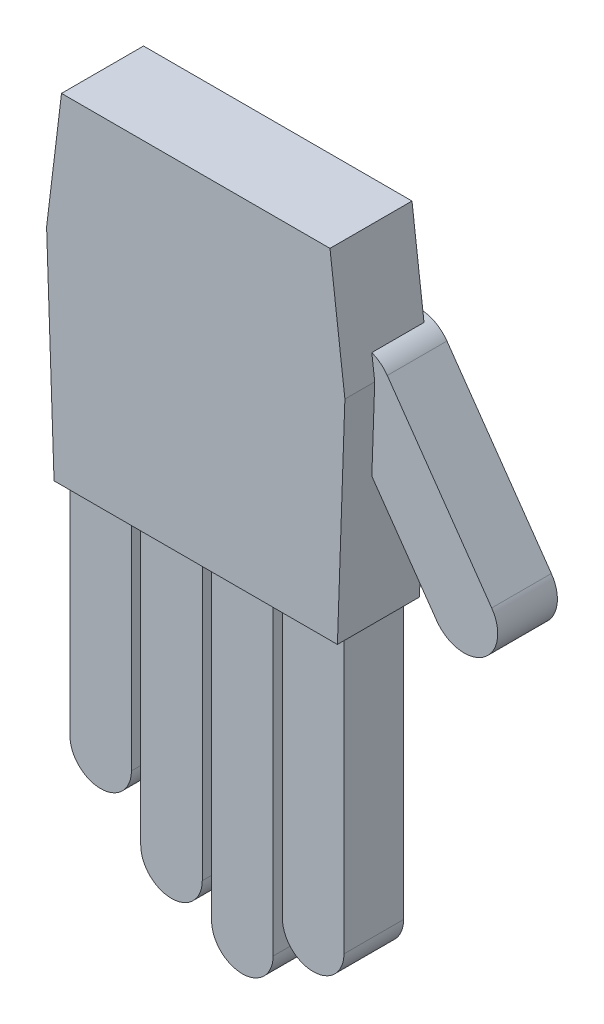
ISO-10303-21;
HEADER;
FILE_DESCRIPTION(('STEP AP214'),'2;1');
FILE_NAME('part.step','',(''),(''),'','','');
FILE_SCHEMA(('AUTOMOTIVE_DESIGN { 1 0 10303 214 1 1 1 1 }'));
ENDSEC;
DATA;
#1=APPLICATION_CONTEXT('core data for automotive mechanical design processes');
#2=APPLICATION_PROTOCOL_DEFINITION('international standard','automotive_design',2000,#1);
#3=PRODUCT_CONTEXT('',#1,'mechanical');
#4=PRODUCT('Part','Part','',(#3));
#5=PRODUCT_RELATED_PRODUCT_CATEGORY('part','',(#4));
#6=PRODUCT_DEFINITION_FORMATION('','',#4);
#7=PRODUCT_DEFINITION_CONTEXT('part definition',#1,'design');
#8=PRODUCT_DEFINITION('design','',#6,#7);
#9=PRODUCT_DEFINITION_SHAPE('','',#8);
#10=(LENGTH_UNIT() NAMED_UNIT(*) SI_UNIT(.MILLI.,.METRE.));
#11=(NAMED_UNIT(*) PLANE_ANGLE_UNIT() SI_UNIT($,.RADIAN.));
#12=(NAMED_UNIT(*) SI_UNIT($,.STERADIAN.) SOLID_ANGLE_UNIT());
#13=UNCERTAINTY_MEASURE_WITH_UNIT(LENGTH_MEASURE(1.E-05),#10,'distance_accuracy_value','');
#14=(GEOMETRIC_REPRESENTATION_CONTEXT(3) GLOBAL_UNCERTAINTY_ASSIGNED_CONTEXT((#13)) GLOBAL_UNIT_ASSIGNED_CONTEXT((#10,
#11,#12)) REPRESENTATION_CONTEXT('',''));
#15=CARTESIAN_POINT('',(0.,0.,0.));
#16=DIRECTION('',(0.,0.,1.));
#17=DIRECTION('',(1.,0.,0.));
#18=AXIS2_PLACEMENT_3D('',#15,#16,#17);
#19=CARTESIAN_POINT('',(40.,-60.,11.));
#20=DIRECTION('',(-0.999405999353588,0.0344622758397789,0.));
#21=DIRECTION('',(-0.0344622758397789,-0.999405999353588,0.));
#22=AXIS2_PLACEMENT_3D('',#19,#20,#21);
#23=PLANE('',#22);
#24=DIRECTION('',(0.,0.,-1.));
#25=VECTOR('',#24,1.);
#26=CARTESIAN_POINT('',(39.2307089176451,-82.3094413882934,11.));
#27=LINE('',#26,#25);
#28=CARTESIAN_POINT('',(39.2307089176451,-82.3094413882934,3.));
#29=VERTEX_POINT('',#28);
#30=CARTESIAN_POINT('',(39.2307089176451,-82.3094413882934,-11.));
#31=VERTEX_POINT('',#30);
#32=EDGE_CURVE('E48',#29,#31,#27,.T.);
#33=ORIENTED_EDGE('',*,*,#32,.F.);
#34=DIRECTION('',(0.0344622758397789,0.999405999353588,0.));
#35=VECTOR('',#34,1.);
#36=CARTESIAN_POINT('',(40.,-60.,3.));
#37=LINE('',#36,#35);
#38=CARTESIAN_POINT('',(40.,-60.,3.));
#39=VERTEX_POINT('',#38);
#40=EDGE_CURVE('E224',#29,#39,#37,.T.);
#41=ORIENTED_EDGE('',*,*,#40,.T.);
#42=DIRECTION('',(0.,0.,-1.));
#43=VECTOR('',#42,1.);
#44=CARTESIAN_POINT('',(40.,-60.,11.));
#45=LINE('',#44,#43);
#46=CARTESIAN_POINT('',(40.,-60.,11.));
#47=VERTEX_POINT('',#46);
#48=EDGE_CURVE('E375',#47,#39,#45,.T.);
#49=ORIENTED_EDGE('',*,*,#48,.F.);
#50=DIRECTION('',(0.0344622758397789,0.999405999353588,0.));
#51=VECTOR('',#50,1.);
#52=CARTESIAN_POINT('',(40.,-60.,11.));
#53=LINE('',#52,#51);
#54=CARTESIAN_POINT('',(38.,-118.,11.));
#55=VERTEX_POINT('',#54);
#56=EDGE_CURVE('E351',#55,#47,#53,.T.);
#57=ORIENTED_EDGE('',*,*,#56,.F.);
#58=DIRECTION('',(0.,0.,-1.));
#59=VECTOR('',#58,1.);
#60=CARTESIAN_POINT('',(38.,-118.,11.));
#61=LINE('',#60,#59);
#62=CARTESIAN_POINT('',(38.,-118.,-11.));
#63=VERTEX_POINT('',#62);
#64=EDGE_CURVE('E378',#55,#63,#61,.T.);
#65=ORIENTED_EDGE('',*,*,#64,.T.);
#66=DIRECTION('',(0.0344622758397789,0.999405999353588,0.));
#67=VECTOR('',#66,1.);
#68=CARTESIAN_POINT('',(40.,-60.,-11.));
#69=LINE('',#68,#67);
#70=EDGE_CURVE('E364',#63,#31,#69,.T.);
#71=ORIENTED_EDGE('',*,*,#70,.T.);
#72=EDGE_LOOP('',(#33,#41,#49,#57,#65,#71));
#73=FACE_BOUND('',#72,.T.);
#74=ADVANCED_FACE('F33',(#73),#23,.F.);
#75=CARTESIAN_POINT('',(36.,-27.,11.));
#76=DIRECTION('',(-0.992733782033708,-0.120331367519237,0.));
#77=DIRECTION('',(0.120331367519237,-0.992733782033708,0.));
#78=AXIS2_PLACEMENT_3D('',#75,#76,#77);
#79=PLANE('',#78);
#80=DIRECTION('',(0.,0.,-1.));
#81=VECTOR('',#80,1.);
#82=CARTESIAN_POINT('',(39.2239075582719,-53.5972373557432,3.));
#83=LINE('',#82,#81);
#84=CARTESIAN_POINT('',(39.2239075582719,-53.5972373557432,-11.));
#85=VERTEX_POINT('',#84);
#86=CARTESIAN_POINT('',(39.2239075582719,-53.5972373557432,3.));
#87=VERTEX_POINT('',#86);
#88=EDGE_CURVE('E259',#85,#87,#83,.F.);
#89=ORIENTED_EDGE('',*,*,#88,.F.);
#90=DIRECTION('',(-0.120331367519237,0.992733782033708,0.));
#91=VECTOR('',#90,1.);
#92=CARTESIAN_POINT('',(36.,-27.,-11.));
#93=LINE('',#92,#91);
#94=CARTESIAN_POINT('',(36.,-27.,-11.));
#95=VERTEX_POINT('',#94);
#96=EDGE_CURVE('E367',#85,#95,#93,.T.);
#97=ORIENTED_EDGE('',*,*,#96,.T.);
#98=DIRECTION('',(0.,0.,-1.));
#99=VECTOR('',#98,1.);
#100=CARTESIAN_POINT('',(36.,-27.,11.));
#101=LINE('',#100,#99);
#102=CARTESIAN_POINT('',(36.,-27.,11.));
#103=VERTEX_POINT('',#102);
#104=EDGE_CURVE('E372',#103,#95,#101,.T.);
#105=ORIENTED_EDGE('',*,*,#104,.F.);
#106=DIRECTION('',(-0.120331367519237,0.992733782033708,0.));
#107=VECTOR('',#106,1.);
#108=CARTESIAN_POINT('',(36.,-27.,11.));
#109=LINE('',#108,#107);
#110=EDGE_CURVE('E353',#47,#103,#109,.T.);
#111=ORIENTED_EDGE('',*,*,#110,.F.);
#112=ORIENTED_EDGE('',*,*,#48,.T.);
#113=DIRECTION('',(-0.120331367519237,0.992733782033708,0.));
#114=VECTOR('',#113,1.);
#115=CARTESIAN_POINT('',(36.,-27.,3.));
#116=LINE('',#115,#114);
#117=EDGE_CURVE('E11',#39,#87,#116,.T.);
#118=ORIENTED_EDGE('',*,*,#117,.T.);
#119=EDGE_LOOP('',(#89,#97,#105,#111,#112,#118));
#120=FACE_BOUND('',#119,.T.);
#121=ADVANCED_FACE('F443',(#120),#79,.F.);
#122=CARTESIAN_POINT('',(0.,0.,-11.));
#123=DIRECTION('',(0.,0.,-1.));
#124=DIRECTION('',(-1.,0.,0.));
#125=AXIS2_PLACEMENT_3D('',#122,#123,#124);
#126=PLANE('',#125);
#127=ORIENTED_EDGE('',*,*,#96,.F.);
#128=CARTESIAN_POINT('',(36.,-62.,-11.));
#129=DIRECTION('',(0.,0.,-1.));
#130=DIRECTION('',(-1.,0.,0.));
#131=AXIS2_PLACEMENT_3D('',#128,#129,#130);
#132=CIRCLE('',#131,9.);
#133=CARTESIAN_POINT('',(28.6269127153286,-67.1611610992699,-11.));
#134=VERTEX_POINT('',#133);
#135=EDGE_CURVE('E41',#85,#134,#132,.F.);
#136=ORIENTED_EDGE('',*,*,#135,.T.);
#137=DIRECTION('',(0.573462344363328,-0.81923192051904,0.));
#138=VECTOR('',#137,1.);
#139=CARTESIAN_POINT('',(-12.3395302376915,-8.63767116638405,-11.));
#140=LINE('',#139,#138);
#141=EDGE_CURVE('E429',#134,#31,#140,.T.);
#142=ORIENTED_EDGE('',*,*,#141,.T.);
#143=ORIENTED_EDGE('',*,*,#70,.F.);
#144=DIRECTION('',(1.,0.,0.));
#145=VECTOR('',#144,1.);
#146=CARTESIAN_POINT('',(38.,-118.,-11.));
#147=LINE('',#146,#145);
#148=CARTESIAN_POINT('',(-38.,-118.,-11.));
#149=VERTEX_POINT('',#148);
#150=EDGE_CURVE('E362',#149,#63,#147,.T.);
#151=ORIENTED_EDGE('',*,*,#150,.F.);
#152=DIRECTION('',(0.0344622758397789,-0.999405999353588,0.));
#153=VECTOR('',#152,1.);
#154=CARTESIAN_POINT('',(-38.,-118.,-11.));
#155=LINE('',#154,#153);
#156=CARTESIAN_POINT('',(-40.,-60.,-11.));
#157=VERTEX_POINT('',#156);
#158=EDGE_CURVE('E360',#157,#149,#155,.T.);
#159=ORIENTED_EDGE('',*,*,#158,.F.);
#160=DIRECTION('',(-0.120331367519237,-0.992733782033708,0.));
#161=VECTOR('',#160,1.);
#162=CARTESIAN_POINT('',(-40.,-60.,-11.));
#163=LINE('',#162,#161);
#164=CARTESIAN_POINT('',(-36.,-27.,-11.));
#165=VERTEX_POINT('',#164);
#166=EDGE_CURVE('E342',#165,#157,#163,.T.);
#167=ORIENTED_EDGE('',*,*,#166,.F.);
#168=DIRECTION('',(-1.,0.,0.));
#169=VECTOR('',#168,1.);
#170=CARTESIAN_POINT('',(-36.,-27.,-11.));
#171=LINE('',#170,#169);
#172=EDGE_CURVE('E347',#95,#165,#171,.T.);
#173=ORIENTED_EDGE('',*,*,#172,.F.);
#174=EDGE_LOOP('',(#127,#136,#142,#143,#151,#159,#167,#173));
#175=FACE_BOUND('',#174,.T.);
#176=ADVANCED_FACE('F433',(#175),#126,.T.);
#177=CARTESIAN_POINT('',(-40.,-60.,11.));
#178=DIRECTION('',(0.992733782033708,-0.120331367519237,0.));
#179=DIRECTION('',(0.120331367519237,0.992733782033708,0.));
#180=AXIS2_PLACEMENT_3D('',#177,#178,#179);
#181=PLANE('',#180);
#182=ORIENTED_EDGE('',*,*,#166,.T.);
#183=DIRECTION('',(0.,0.,-1.));
#184=VECTOR('',#183,1.);
#185=CARTESIAN_POINT('',(-40.,-60.,11.));
#186=LINE('',#185,#184);
#187=CARTESIAN_POINT('',(-40.,-60.,11.));
#188=VERTEX_POINT('',#187);
#189=EDGE_CURVE('E384',#188,#157,#186,.T.);
#190=ORIENTED_EDGE('',*,*,#189,.F.);
#191=DIRECTION('',(-0.120331367519237,-0.992733782033708,0.));
#192=VECTOR('',#191,1.);
#193=CARTESIAN_POINT('',(-40.,-60.,11.));
#194=LINE('',#193,#192);
#195=CARTESIAN_POINT('',(-36.,-27.,11.));
#196=VERTEX_POINT('',#195);
#197=EDGE_CURVE('E343',#196,#188,#194,.T.);
#198=ORIENTED_EDGE('',*,*,#197,.F.);
#199=DIRECTION('',(0.,0.,-1.));
#200=VECTOR('',#199,1.);
#201=CARTESIAN_POINT('',(-36.,-27.,11.));
#202=LINE('',#201,#200);
#203=EDGE_CURVE('E357',#196,#165,#202,.T.);
#204=ORIENTED_EDGE('',*,*,#203,.T.);
#205=EDGE_LOOP('',(#182,#190,#198,#204));
#206=FACE_BOUND('',#205,.T.);
#207=ADVANCED_FACE('F35',(#206),#181,.F.);
#208=CARTESIAN_POINT('',(-38.,-118.,11.));
#209=DIRECTION('',(0.999405999353588,0.0344622758397789,0.));
#210=DIRECTION('',(-0.0344622758397789,0.999405999353588,0.));
#211=AXIS2_PLACEMENT_3D('',#208,#209,#210);
#212=PLANE('',#211);
#213=ORIENTED_EDGE('',*,*,#158,.T.);
#214=DIRECTION('',(0.,0.,-1.));
#215=VECTOR('',#214,1.);
#216=CARTESIAN_POINT('',(-38.,-118.,11.));
#217=LINE('',#216,#215);
#218=CARTESIAN_POINT('',(-38.,-118.,11.));
#219=VERTEX_POINT('',#218);
#220=EDGE_CURVE('E381',#219,#149,#217,.T.);
#221=ORIENTED_EDGE('',*,*,#220,.F.);
#222=DIRECTION('',(0.0344622758397789,-0.999405999353588,0.));
#223=VECTOR('',#222,1.);
#224=CARTESIAN_POINT('',(-38.,-118.,11.));
#225=LINE('',#224,#223);
#226=EDGE_CURVE('E346',#188,#219,#225,.T.);
#227=ORIENTED_EDGE('',*,*,#226,.F.);
#228=ORIENTED_EDGE('',*,*,#189,.T.);
#229=EDGE_LOOP('',(#213,#221,#227,#228));
#230=FACE_BOUND('',#229,.T.);
#231=ADVANCED_FACE('F457',(#230),#212,.F.);
#232=CARTESIAN_POINT('',(38.,-118.,11.));
#233=DIRECTION('',(0.,1.,0.));
#234=DIRECTION('',(0.,0.,1.));
#235=AXIS2_PLACEMENT_3D('',#232,#233,#234);
#236=PLANE('',#235);
#237=DIRECTION('',(0.,0.,-1.));
#238=VECTOR('',#237,1.);
#239=CARTESIAN_POINT('',(20.25,-118.,11.));
#240=LINE('',#239,#238);
#241=CARTESIAN_POINT('',(20.25,-118.,8.));
#242=VERTEX_POINT('',#241);
#243=CARTESIAN_POINT('',(20.25,-118.,-8.));
#244=VERTEX_POINT('',#243);
#245=EDGE_CURVE('E56',#242,#244,#240,.T.);
#246=ORIENTED_EDGE('',*,*,#245,.F.);
#247=DIRECTION('',(1.,0.,0.));
#248=VECTOR('',#247,1.);
#249=CARTESIAN_POINT('',(38.,-118.,8.));
#250=LINE('',#249,#248);
#251=CARTESIAN_POINT('',(36.75,-118.,8.));
#252=VERTEX_POINT('',#251);
#253=EDGE_CURVE('E427',#242,#252,#250,.T.);
#254=ORIENTED_EDGE('',*,*,#253,.T.);
#255=DIRECTION('',(0.,0.,1.));
#256=VECTOR('',#255,1.);
#257=CARTESIAN_POINT('',(36.75,-118.,11.));
#258=LINE('',#257,#256);
#259=CARTESIAN_POINT('',(36.75,-118.,-8.));
#260=VERTEX_POINT('',#259);
#261=EDGE_CURVE('E423',#260,#252,#258,.T.);
#262=ORIENTED_EDGE('',*,*,#261,.F.);
#263=DIRECTION('',(1.,0.,0.));
#264=VECTOR('',#263,1.);
#265=CARTESIAN_POINT('',(38.,-118.,-8.));
#266=LINE('',#265,#264);
#267=EDGE_CURVE('E420',#244,#260,#266,.T.);
#268=ORIENTED_EDGE('',*,*,#267,.F.);
#269=EDGE_LOOP('',(#246,#254,#262,#268));
#270=FACE_BOUND('',#269,.T.);
#271=DIRECTION('',(0.,0.,-1.));
#272=VECTOR('',#271,1.);
#273=CARTESIAN_POINT('',(1.25,-118.,11.));
#274=LINE('',#273,#272);
#275=CARTESIAN_POINT('',(1.25,-118.,8.));
#276=VERTEX_POINT('',#275);
#277=CARTESIAN_POINT('',(1.25,-118.,-8.));
#278=VERTEX_POINT('',#277);
#279=EDGE_CURVE('E415',#276,#278,#274,.T.);
#280=ORIENTED_EDGE('',*,*,#279,.F.);
#281=DIRECTION('',(1.,0.,0.));
#282=VECTOR('',#281,1.);
#283=CARTESIAN_POINT('',(38.,-118.,8.));
#284=LINE('',#283,#282);
#285=CARTESIAN_POINT('',(17.75,-118.,8.));
#286=VERTEX_POINT('',#285);
#287=EDGE_CURVE('E418',#276,#286,#284,.T.);
#288=ORIENTED_EDGE('',*,*,#287,.T.);
#289=DIRECTION('',(0.,0.,1.));
#290=VECTOR('',#289,1.);
#291=CARTESIAN_POINT('',(17.75,-118.,11.));
#292=LINE('',#291,#290);
#293=CARTESIAN_POINT('',(17.75,-118.,-8.));
#294=VERTEX_POINT('',#293);
#295=EDGE_CURVE('E412',#294,#286,#292,.T.);
#296=ORIENTED_EDGE('',*,*,#295,.F.);
#297=DIRECTION('',(1.,0.,0.));
#298=VECTOR('',#297,1.);
#299=CARTESIAN_POINT('',(38.,-118.,-8.));
#300=LINE('',#299,#298);
#301=EDGE_CURVE('E409',#278,#294,#300,.T.);
#302=ORIENTED_EDGE('',*,*,#301,.F.);
#303=EDGE_LOOP('',(#280,#288,#296,#302));
#304=FACE_BOUND('',#303,.T.);
#305=DIRECTION('',(0.,0.,-1.));
#306=VECTOR('',#305,1.);
#307=CARTESIAN_POINT('',(-17.75,-118.,11.));
#308=LINE('',#307,#306);
#309=CARTESIAN_POINT('',(-17.75,-118.,8.));
#310=VERTEX_POINT('',#309);
#311=CARTESIAN_POINT('',(-17.75,-118.,-8.));
#312=VERTEX_POINT('',#311);
#313=EDGE_CURVE('E404',#310,#312,#308,.T.);
#314=ORIENTED_EDGE('',*,*,#313,.F.);
#315=DIRECTION('',(1.,0.,0.));
#316=VECTOR('',#315,1.);
#317=CARTESIAN_POINT('',(38.,-118.,8.));
#318=LINE('',#317,#316);
#319=CARTESIAN_POINT('',(-1.25,-118.,8.));
#320=VERTEX_POINT('',#319);
#321=EDGE_CURVE('E407',#310,#320,#318,.T.);
#322=ORIENTED_EDGE('',*,*,#321,.T.);
#323=DIRECTION('',(0.,0.,1.));
#324=VECTOR('',#323,1.);
#325=CARTESIAN_POINT('',(-1.25,-118.,11.));
#326=LINE('',#325,#324);
#327=CARTESIAN_POINT('',(-1.25,-118.,-8.));
#328=VERTEX_POINT('',#327);
#329=EDGE_CURVE('E401',#328,#320,#326,.T.);
#330=ORIENTED_EDGE('',*,*,#329,.F.);
#331=DIRECTION('',(1.,0.,0.));
#332=VECTOR('',#331,1.);
#333=CARTESIAN_POINT('',(38.,-118.,-8.));
#334=LINE('',#333,#332);
#335=EDGE_CURVE('E398',#312,#328,#334,.T.);
#336=ORIENTED_EDGE('',*,*,#335,.F.);
#337=EDGE_LOOP('',(#314,#322,#330,#336));
#338=FACE_BOUND('',#337,.T.);
#339=DIRECTION('',(0.,0.,-1.));
#340=VECTOR('',#339,1.);
#341=CARTESIAN_POINT('',(-36.75,-118.,11.));
#342=LINE('',#341,#340);
#343=CARTESIAN_POINT('',(-36.75,-118.,8.));
#344=VERTEX_POINT('',#343);
#345=CARTESIAN_POINT('',(-36.75,-118.,-8.));
#346=VERTEX_POINT('',#345);
#347=EDGE_CURVE('E393',#344,#346,#342,.T.);
#348=ORIENTED_EDGE('',*,*,#347,.F.);
#349=DIRECTION('',(1.,0.,0.));
#350=VECTOR('',#349,1.);
#351=CARTESIAN_POINT('',(38.,-118.,8.));
#352=LINE('',#351,#350);
#353=CARTESIAN_POINT('',(-20.25,-118.,8.));
#354=VERTEX_POINT('',#353);
#355=EDGE_CURVE('E396',#344,#354,#352,.T.);
#356=ORIENTED_EDGE('',*,*,#355,.T.);
#357=DIRECTION('',(0.,0.,1.));
#358=VECTOR('',#357,1.);
#359=CARTESIAN_POINT('',(-20.25,-118.,11.));
#360=LINE('',#359,#358);
#361=CARTESIAN_POINT('',(-20.25,-118.,-8.));
#362=VERTEX_POINT('',#361);
#363=EDGE_CURVE('E390',#362,#354,#360,.T.);
#364=ORIENTED_EDGE('',*,*,#363,.F.);
#365=DIRECTION('',(1.,0.,0.));
#366=VECTOR('',#365,1.);
#367=CARTESIAN_POINT('',(38.,-118.,-8.));
#368=LINE('',#367,#366);
#369=EDGE_CURVE('E387',#346,#362,#368,.T.);
#370=ORIENTED_EDGE('',*,*,#369,.F.);
#371=EDGE_LOOP('',(#348,#356,#364,#370));
#372=FACE_BOUND('',#371,.T.);
#373=ORIENTED_EDGE('',*,*,#150,.T.);
#374=ORIENTED_EDGE('',*,*,#64,.F.);
#375=DIRECTION('',(1.,0.,0.));
#376=VECTOR('',#375,1.);
#377=CARTESIAN_POINT('',(38.,-118.,11.));
#378=LINE('',#377,#376);
#379=EDGE_CURVE('E349',#219,#55,#378,.T.);
#380=ORIENTED_EDGE('',*,*,#379,.F.);
#381=ORIENTED_EDGE('',*,*,#220,.T.);
#382=EDGE_LOOP('',(#373,#374,#380,#381));
#383=FACE_BOUND('',#382,.T.);
#384=ADVANCED_FACE('F453',(#270,#304,#338,#372,#383),#236,.F.);
#385=CARTESIAN_POINT('',(-36.,-27.,11.));
#386=DIRECTION('',(0.,-1.,0.));
#387=DIRECTION('',(0.,0.,-1.));
#388=AXIS2_PLACEMENT_3D('',#385,#386,#387);
#389=PLANE('',#388);
#390=ORIENTED_EDGE('',*,*,#172,.T.);
#391=ORIENTED_EDGE('',*,*,#203,.F.);
#392=DIRECTION('',(-1.,0.,0.));
#393=VECTOR('',#392,1.);
#394=CARTESIAN_POINT('',(-36.,-27.,11.));
#395=LINE('',#394,#393);
#396=EDGE_CURVE('E355',#103,#196,#395,.T.);
#397=ORIENTED_EDGE('',*,*,#396,.F.);
#398=ORIENTED_EDGE('',*,*,#104,.T.);
#399=EDGE_LOOP('',(#390,#391,#397,#398));
#400=FACE_BOUND('',#399,.T.);
#401=ADVANCED_FACE('F463',(#400),#389,.F.);
#402=CARTESIAN_POINT('',(0.,0.,11.));
#403=DIRECTION('',(0.,0.,-1.));
#404=DIRECTION('',(-1.,0.,0.));
#405=AXIS2_PLACEMENT_3D('',#402,#403,#404);
#406=PLANE('',#405);
#407=ORIENTED_EDGE('',*,*,#197,.T.);
#408=ORIENTED_EDGE('',*,*,#226,.T.);
#409=ORIENTED_EDGE('',*,*,#379,.T.);
#410=ORIENTED_EDGE('',*,*,#56,.T.);
#411=ORIENTED_EDGE('',*,*,#110,.T.);
#412=ORIENTED_EDGE('',*,*,#396,.T.);
#413=EDGE_LOOP('',(#407,#408,#409,#410,#411,#412));
#414=FACE_BOUND('',#413,.T.);
#415=ADVANCED_FACE('F466',(#414),#406,.F.);
#416=CARTESIAN_POINT('',(-36.75,-112.,8.));
#417=DIRECTION('',(1.,0.,0.));
#418=DIRECTION('',(0.,0.,-1.));
#419=AXIS2_PLACEMENT_3D('',#416,#417,#418);
#420=PLANE('',#419);
#421=DIRECTION('',(0.,-1.,0.));
#422=VECTOR('',#421,1.);
#423=CARTESIAN_POINT('',(-36.75,-112.,8.));
#424=LINE('',#423,#422);
#425=CARTESIAN_POINT('',(-36.75,-178.,8.));
#426=VERTEX_POINT('',#425);
#427=EDGE_CURVE('E323',#344,#426,#424,.T.);
#428=ORIENTED_EDGE('',*,*,#427,.F.);
#429=ORIENTED_EDGE('',*,*,#347,.T.);
#430=DIRECTION('',(0.,-1.,0.));
#431=VECTOR('',#430,1.);
#432=CARTESIAN_POINT('',(-36.75,-112.,-8.));
#433=LINE('',#432,#431);
#434=CARTESIAN_POINT('',(-36.75,-178.,-8.));
#435=VERTEX_POINT('',#434);
#436=EDGE_CURVE('E322',#346,#435,#433,.T.);
#437=ORIENTED_EDGE('',*,*,#436,.T.);
#438=DIRECTION('',(0.,0.,-1.));
#439=VECTOR('',#438,1.);
#440=CARTESIAN_POINT('',(-36.75,-178.,8.));
#441=LINE('',#440,#439);
#442=EDGE_CURVE('E339',#426,#435,#441,.T.);
#443=ORIENTED_EDGE('',*,*,#442,.F.);
#444=EDGE_LOOP('',(#428,#429,#437,#443));
#445=FACE_BOUND('',#444,.T.);
#446=ADVANCED_FACE('F468',(#445),#420,.F.);
#447=CARTESIAN_POINT('',(-20.25,-112.,8.));
#448=DIRECTION('',(-1.,0.,0.));
#449=DIRECTION('',(0.,0.,1.));
#450=AXIS2_PLACEMENT_3D('',#447,#448,#449);
#451=PLANE('',#450);
#452=DIRECTION('',(0.,1.,0.));
#453=VECTOR('',#452,1.);
#454=CARTESIAN_POINT('',(-20.25,-112.,-8.));
#455=LINE('',#454,#453);
#456=CARTESIAN_POINT('',(-20.25,-178.,-8.));
#457=VERTEX_POINT('',#456);
#458=EDGE_CURVE('E326',#457,#362,#455,.T.);
#459=ORIENTED_EDGE('',*,*,#458,.T.);
#460=ORIENTED_EDGE('',*,*,#363,.T.);
#461=DIRECTION('',(0.,1.,0.));
#462=VECTOR('',#461,1.);
#463=CARTESIAN_POINT('',(-20.25,-112.,8.));
#464=LINE('',#463,#462);
#465=CARTESIAN_POINT('',(-20.25,-178.,8.));
#466=VERTEX_POINT('',#465);
#467=EDGE_CURVE('E328',#466,#354,#464,.T.);
#468=ORIENTED_EDGE('',*,*,#467,.F.);
#469=DIRECTION('',(0.,0.,-1.));
#470=VECTOR('',#469,1.);
#471=CARTESIAN_POINT('',(-20.25,-178.,8.));
#472=LINE('',#471,#470);
#473=EDGE_CURVE('E331',#466,#457,#472,.T.);
#474=ORIENTED_EDGE('',*,*,#473,.T.);
#475=EDGE_LOOP('',(#459,#460,#468,#474));
#476=FACE_BOUND('',#475,.T.);
#477=ADVANCED_FACE('F474',(#476),#451,.F.);
#478=CARTESIAN_POINT('',(-28.5,-112.,8.));
#479=DIRECTION('',(0.,0.,1.));
#480=DIRECTION('',(1.,0.,0.));
#481=AXIS2_PLACEMENT_3D('',#478,#479,#480);
#482=PLANE('',#481);
#483=ORIENTED_EDGE('',*,*,#355,.F.);
#484=ORIENTED_EDGE('',*,*,#427,.T.);
#485=CARTESIAN_POINT('',(-28.5,-178.,8.));
#486=DIRECTION('',(0.,0.,1.));
#487=DIRECTION('',(1.,0.,0.));
#488=AXIS2_PLACEMENT_3D('',#485,#486,#487);
#489=CIRCLE('',#488,8.25);
#490=EDGE_CURVE('E325',#426,#466,#489,.T.);
#491=ORIENTED_EDGE('',*,*,#490,.T.);
#492=ORIENTED_EDGE('',*,*,#467,.T.);
#493=EDGE_LOOP('',(#483,#484,#491,#492));
#494=FACE_BOUND('',#493,.T.);
#495=ADVANCED_FACE('F685',(#494),#482,.T.);
#496=CARTESIAN_POINT('',(-28.5,-112.,-8.));
#497=DIRECTION('',(0.,0.,1.));
#498=DIRECTION('',(1.,0.,0.));
#499=AXIS2_PLACEMENT_3D('',#496,#497,#498);
#500=PLANE('',#499);
#501=ORIENTED_EDGE('',*,*,#436,.F.);
#502=ORIENTED_EDGE('',*,*,#369,.T.);
#503=ORIENTED_EDGE('',*,*,#458,.F.);
#504=CARTESIAN_POINT('',(-28.5,-178.,-8.));
#505=DIRECTION('',(0.,0.,1.));
#506=DIRECTION('',(1.,0.,0.));
#507=AXIS2_PLACEMENT_3D('',#504,#505,#506);
#508=CIRCLE('',#507,8.25);
#509=EDGE_CURVE('E333',#435,#457,#508,.T.);
#510=ORIENTED_EDGE('',*,*,#509,.F.);
#511=EDGE_LOOP('',(#501,#502,#503,#510));
#512=FACE_BOUND('',#511,.T.);
#513=ADVANCED_FACE('F675',(#512),#500,.F.);
#514=CARTESIAN_POINT('',(-28.5,-178.,8.));
#515=DIRECTION('',(0.,0.,-1.));
#516=DIRECTION('',(-1.,0.,0.));
#517=AXIS2_PLACEMENT_3D('',#514,#515,#516);
#518=CYLINDRICAL_SURFACE('',#517,8.25);
#519=ORIENTED_EDGE('',*,*,#509,.T.);
#520=ORIENTED_EDGE('',*,*,#473,.F.);
#521=ORIENTED_EDGE('',*,*,#490,.F.);
#522=ORIENTED_EDGE('',*,*,#442,.T.);
#523=EDGE_LOOP('',(#519,#520,#521,#522));
#524=FACE_BOUND('',#523,.T.);
#525=ADVANCED_FACE('F665',(#524),#518,.T.);
#526=CARTESIAN_POINT('',(-17.75,-112.,8.));
#527=DIRECTION('',(1.,0.,0.));
#528=DIRECTION('',(0.,0.,-1.));
#529=AXIS2_PLACEMENT_3D('',#526,#527,#528);
#530=PLANE('',#529);
#531=DIRECTION('',(0.,-1.,0.));
#532=VECTOR('',#531,1.);
#533=CARTESIAN_POINT('',(-17.75,-112.,8.));
#534=LINE('',#533,#532);
#535=CARTESIAN_POINT('',(-17.75,-194.,8.));
#536=VERTEX_POINT('',#535);
#537=EDGE_CURVE('E303',#310,#536,#534,.T.);
#538=ORIENTED_EDGE('',*,*,#537,.F.);
#539=ORIENTED_EDGE('',*,*,#313,.T.);
#540=DIRECTION('',(0.,-1.,0.));
#541=VECTOR('',#540,1.);
#542=CARTESIAN_POINT('',(-17.75,-112.,-8.));
#543=LINE('',#542,#541);
#544=CARTESIAN_POINT('',(-17.75,-194.,-8.));
#545=VERTEX_POINT('',#544);
#546=EDGE_CURVE('E302',#312,#545,#543,.T.);
#547=ORIENTED_EDGE('',*,*,#546,.T.);
#548=DIRECTION('',(0.,0.,-1.));
#549=VECTOR('',#548,1.);
#550=CARTESIAN_POINT('',(-17.75,-194.,8.));
#551=LINE('',#550,#549);
#552=EDGE_CURVE('E319',#536,#545,#551,.T.);
#553=ORIENTED_EDGE('',*,*,#552,.F.);
#554=EDGE_LOOP('',(#538,#539,#547,#553));
#555=FACE_BOUND('',#554,.T.);
#556=ADVANCED_FACE('F655',(#555),#530,.F.);
#557=CARTESIAN_POINT('',(-1.25,-112.,8.));
#558=DIRECTION('',(-1.,0.,0.));
#559=DIRECTION('',(0.,0.,1.));
#560=AXIS2_PLACEMENT_3D('',#557,#558,#559);
#561=PLANE('',#560);
#562=DIRECTION('',(0.,1.,0.));
#563=VECTOR('',#562,1.);
#564=CARTESIAN_POINT('',(-1.25,-112.,-8.));
#565=LINE('',#564,#563);
#566=CARTESIAN_POINT('',(-1.25,-194.,-8.));
#567=VERTEX_POINT('',#566);
#568=EDGE_CURVE('E306',#567,#328,#565,.T.);
#569=ORIENTED_EDGE('',*,*,#568,.T.);
#570=ORIENTED_EDGE('',*,*,#329,.T.);
#571=DIRECTION('',(0.,1.,0.));
#572=VECTOR('',#571,1.);
#573=CARTESIAN_POINT('',(-1.25,-112.,8.));
#574=LINE('',#573,#572);
#575=CARTESIAN_POINT('',(-1.25,-194.,8.));
#576=VERTEX_POINT('',#575);
#577=EDGE_CURVE('E308',#576,#320,#574,.T.);
#578=ORIENTED_EDGE('',*,*,#577,.F.);
#579=DIRECTION('',(0.,0.,-1.));
#580=VECTOR('',#579,1.);
#581=CARTESIAN_POINT('',(-1.25,-194.,8.));
#582=LINE('',#581,#580);
#583=EDGE_CURVE('E311',#576,#567,#582,.T.);
#584=ORIENTED_EDGE('',*,*,#583,.T.);
#585=EDGE_LOOP('',(#569,#570,#578,#584));
#586=FACE_BOUND('',#585,.T.);
#587=ADVANCED_FACE('F645',(#586),#561,.F.);
#588=CARTESIAN_POINT('',(-9.5,-112.,8.));
#589=DIRECTION('',(0.,0.,1.));
#590=DIRECTION('',(1.,0.,0.));
#591=AXIS2_PLACEMENT_3D('',#588,#589,#590);
#592=PLANE('',#591);
#593=ORIENTED_EDGE('',*,*,#321,.F.);
#594=ORIENTED_EDGE('',*,*,#537,.T.);
#595=CARTESIAN_POINT('',(-9.5,-194.,8.));
#596=DIRECTION('',(0.,0.,1.));
#597=DIRECTION('',(1.,0.,0.));
#598=AXIS2_PLACEMENT_3D('',#595,#596,#597);
#599=CIRCLE('',#598,8.25);
#600=EDGE_CURVE('E305',#536,#576,#599,.T.);
#601=ORIENTED_EDGE('',*,*,#600,.T.);
#602=ORIENTED_EDGE('',*,*,#577,.T.);
#603=EDGE_LOOP('',(#593,#594,#601,#602));
#604=FACE_BOUND('',#603,.T.);
#605=ADVANCED_FACE('F635',(#604),#592,.T.);
#606=CARTESIAN_POINT('',(-9.5,-112.,-8.));
#607=DIRECTION('',(0.,0.,1.));
#608=DIRECTION('',(1.,0.,0.));
#609=AXIS2_PLACEMENT_3D('',#606,#607,#608);
#610=PLANE('',#609);
#611=ORIENTED_EDGE('',*,*,#546,.F.);
#612=ORIENTED_EDGE('',*,*,#335,.T.);
#613=ORIENTED_EDGE('',*,*,#568,.F.);
#614=CARTESIAN_POINT('',(-9.5,-194.,-8.));
#615=DIRECTION('',(0.,0.,1.));
#616=DIRECTION('',(1.,0.,0.));
#617=AXIS2_PLACEMENT_3D('',#614,#615,#616);
#618=CIRCLE('',#617,8.25);
#619=EDGE_CURVE('E313',#545,#567,#618,.T.);
#620=ORIENTED_EDGE('',*,*,#619,.F.);
#621=EDGE_LOOP('',(#611,#612,#613,#620));
#622=FACE_BOUND('',#621,.T.);
#623=ADVANCED_FACE('F625',(#622),#610,.F.);
#624=CARTESIAN_POINT('',(-9.5,-194.,8.));
#625=DIRECTION('',(0.,0.,-1.));
#626=DIRECTION('',(-1.,0.,0.));
#627=AXIS2_PLACEMENT_3D('',#624,#625,#626);
#628=CYLINDRICAL_SURFACE('',#627,8.25);
#629=ORIENTED_EDGE('',*,*,#619,.T.);
#630=ORIENTED_EDGE('',*,*,#583,.F.);
#631=ORIENTED_EDGE('',*,*,#600,.F.);
#632=ORIENTED_EDGE('',*,*,#552,.T.);
#633=EDGE_LOOP('',(#629,#630,#631,#632));
#634=FACE_BOUND('',#633,.T.);
#635=ADVANCED_FACE('F615',(#634),#628,.T.);
#636=CARTESIAN_POINT('',(1.25,-112.,8.));
#637=DIRECTION('',(1.,0.,0.));
#638=DIRECTION('',(0.,0.,-1.));
#639=AXIS2_PLACEMENT_3D('',#636,#637,#638);
#640=PLANE('',#639);
#641=DIRECTION('',(0.,-1.,0.));
#642=VECTOR('',#641,1.);
#643=CARTESIAN_POINT('',(1.25,-112.,8.));
#644=LINE('',#643,#642);
#645=CARTESIAN_POINT('',(1.25,-202.,8.));
#646=VERTEX_POINT('',#645);
#647=EDGE_CURVE('E283',#276,#646,#644,.T.);
#648=ORIENTED_EDGE('',*,*,#647,.F.);
#649=ORIENTED_EDGE('',*,*,#279,.T.);
#650=DIRECTION('',(0.,-1.,0.));
#651=VECTOR('',#650,1.);
#652=CARTESIAN_POINT('',(1.25,-112.,-8.));
#653=LINE('',#652,#651);
#654=CARTESIAN_POINT('',(1.25,-202.,-8.));
#655=VERTEX_POINT('',#654);
#656=EDGE_CURVE('E282',#278,#655,#653,.T.);
#657=ORIENTED_EDGE('',*,*,#656,.T.);
#658=DIRECTION('',(0.,0.,-1.));
#659=VECTOR('',#658,1.);
#660=CARTESIAN_POINT('',(1.25,-202.,8.));
#661=LINE('',#660,#659);
#662=EDGE_CURVE('E299',#646,#655,#661,.T.);
#663=ORIENTED_EDGE('',*,*,#662,.F.);
#664=EDGE_LOOP('',(#648,#649,#657,#663));
#665=FACE_BOUND('',#664,.T.);
#666=ADVANCED_FACE('F605',(#665),#640,.F.);
#667=CARTESIAN_POINT('',(17.75,-112.,8.));
#668=DIRECTION('',(-1.,0.,0.));
#669=DIRECTION('',(0.,0.,1.));
#670=AXIS2_PLACEMENT_3D('',#667,#668,#669);
#671=PLANE('',#670);
#672=DIRECTION('',(0.,1.,0.));
#673=VECTOR('',#672,1.);
#674=CARTESIAN_POINT('',(17.75,-112.,-8.));
#675=LINE('',#674,#673);
#676=CARTESIAN_POINT('',(17.75,-202.,-8.));
#677=VERTEX_POINT('',#676);
#678=EDGE_CURVE('E286',#677,#294,#675,.T.);
#679=ORIENTED_EDGE('',*,*,#678,.T.);
#680=ORIENTED_EDGE('',*,*,#295,.T.);
#681=DIRECTION('',(0.,1.,0.));
#682=VECTOR('',#681,1.);
#683=CARTESIAN_POINT('',(17.75,-112.,8.));
#684=LINE('',#683,#682);
#685=CARTESIAN_POINT('',(17.75,-202.,8.));
#686=VERTEX_POINT('',#685);
#687=EDGE_CURVE('E288',#686,#286,#684,.T.);
#688=ORIENTED_EDGE('',*,*,#687,.F.);
#689=DIRECTION('',(0.,0.,-1.));
#690=VECTOR('',#689,1.);
#691=CARTESIAN_POINT('',(17.75,-202.,8.));
#692=LINE('',#691,#690);
#693=EDGE_CURVE('E291',#686,#677,#692,.T.);
#694=ORIENTED_EDGE('',*,*,#693,.T.);
#695=EDGE_LOOP('',(#679,#680,#688,#694));
#696=FACE_BOUND('',#695,.T.);
#697=ADVANCED_FACE('F595',(#696),#671,.F.);
#698=CARTESIAN_POINT('',(9.5,-112.,8.));
#699=DIRECTION('',(0.,0.,1.));
#700=DIRECTION('',(1.,0.,0.));
#701=AXIS2_PLACEMENT_3D('',#698,#699,#700);
#702=PLANE('',#701);
#703=ORIENTED_EDGE('',*,*,#287,.F.);
#704=ORIENTED_EDGE('',*,*,#647,.T.);
#705=CARTESIAN_POINT('',(9.5,-202.,8.));
#706=DIRECTION('',(0.,0.,1.));
#707=DIRECTION('',(1.,0.,0.));
#708=AXIS2_PLACEMENT_3D('',#705,#706,#707);
#709=CIRCLE('',#708,8.25);
#710=EDGE_CURVE('E285',#646,#686,#709,.T.);
#711=ORIENTED_EDGE('',*,*,#710,.T.);
#712=ORIENTED_EDGE('',*,*,#687,.T.);
#713=EDGE_LOOP('',(#703,#704,#711,#712));
#714=FACE_BOUND('',#713,.T.);
#715=ADVANCED_FACE('F585',(#714),#702,.T.);
#716=CARTESIAN_POINT('',(9.5,-112.,-8.));
#717=DIRECTION('',(0.,0.,1.));
#718=DIRECTION('',(1.,0.,0.));
#719=AXIS2_PLACEMENT_3D('',#716,#717,#718);
#720=PLANE('',#719);
#721=ORIENTED_EDGE('',*,*,#656,.F.);
#722=ORIENTED_EDGE('',*,*,#301,.T.);
#723=ORIENTED_EDGE('',*,*,#678,.F.);
#724=CARTESIAN_POINT('',(9.5,-202.,-8.));
#725=DIRECTION('',(0.,0.,1.));
#726=DIRECTION('',(1.,0.,0.));
#727=AXIS2_PLACEMENT_3D('',#724,#725,#726);
#728=CIRCLE('',#727,8.25);
#729=EDGE_CURVE('E293',#655,#677,#728,.T.);
#730=ORIENTED_EDGE('',*,*,#729,.F.);
#731=EDGE_LOOP('',(#721,#722,#723,#730));
#732=FACE_BOUND('',#731,.T.);
#733=ADVANCED_FACE('F575',(#732),#720,.F.);
#734=CARTESIAN_POINT('',(9.5,-202.,8.));
#735=DIRECTION('',(0.,0.,-1.));
#736=DIRECTION('',(-1.,0.,0.));
#737=AXIS2_PLACEMENT_3D('',#734,#735,#736);
#738=CYLINDRICAL_SURFACE('',#737,8.25);
#739=ORIENTED_EDGE('',*,*,#729,.T.);
#740=ORIENTED_EDGE('',*,*,#693,.F.);
#741=ORIENTED_EDGE('',*,*,#710,.F.);
#742=ORIENTED_EDGE('',*,*,#662,.T.);
#743=EDGE_LOOP('',(#739,#740,#741,#742));
#744=FACE_BOUND('',#743,.T.);
#745=ADVANCED_FACE('F557',(#744),#738,.T.);
#746=CARTESIAN_POINT('',(20.25,-112.,8.));
#747=DIRECTION('',(1.,0.,0.));
#748=DIRECTION('',(0.,0.,-1.));
#749=AXIS2_PLACEMENT_3D('',#746,#747,#748);
#750=PLANE('',#749);
#751=DIRECTION('',(0.,-1.,0.));
#752=VECTOR('',#751,1.);
#753=CARTESIAN_POINT('',(20.25,-112.,8.));
#754=LINE('',#753,#752);
#755=CARTESIAN_POINT('',(20.25,-192.,8.));
#756=VERTEX_POINT('',#755);
#757=EDGE_CURVE('E263',#242,#756,#754,.T.);
#758=ORIENTED_EDGE('',*,*,#757,.F.);
#759=ORIENTED_EDGE('',*,*,#245,.T.);
#760=DIRECTION('',(0.,-1.,0.));
#761=VECTOR('',#760,1.);
#762=CARTESIAN_POINT('',(20.25,-112.,-8.));
#763=LINE('',#762,#761);
#764=CARTESIAN_POINT('',(20.25,-192.,-8.));
#765=VERTEX_POINT('',#764);
#766=EDGE_CURVE('E262',#244,#765,#763,.T.);
#767=ORIENTED_EDGE('',*,*,#766,.T.);
#768=DIRECTION('',(0.,0.,-1.));
#769=VECTOR('',#768,1.);
#770=CARTESIAN_POINT('',(20.25,-192.,8.));
#771=LINE('',#770,#769);
#772=EDGE_CURVE('E279',#756,#765,#771,.T.);
#773=ORIENTED_EDGE('',*,*,#772,.F.);
#774=EDGE_LOOP('',(#758,#759,#767,#773));
#775=FACE_BOUND('',#774,.T.);
#776=ADVANCED_FACE('F547',(#775),#750,.F.);
#777=CARTESIAN_POINT('',(36.75,-112.,8.));
#778=DIRECTION('',(-1.,0.,0.));
#779=DIRECTION('',(0.,0.,1.));
#780=AXIS2_PLACEMENT_3D('',#777,#778,#779);
#781=PLANE('',#780);
#782=DIRECTION('',(0.,1.,0.));
#783=VECTOR('',#782,1.);
#784=CARTESIAN_POINT('',(36.75,-112.,-8.));
#785=LINE('',#784,#783);
#786=CARTESIAN_POINT('',(36.75,-192.,-8.));
#787=VERTEX_POINT('',#786);
#788=EDGE_CURVE('E266',#787,#260,#785,.T.);
#789=ORIENTED_EDGE('',*,*,#788,.T.);
#790=ORIENTED_EDGE('',*,*,#261,.T.);
#791=DIRECTION('',(0.,1.,0.));
#792=VECTOR('',#791,1.);
#793=CARTESIAN_POINT('',(36.75,-112.,8.));
#794=LINE('',#793,#792);
#795=CARTESIAN_POINT('',(36.75,-192.,8.));
#796=VERTEX_POINT('',#795);
#797=EDGE_CURVE('E268',#796,#252,#794,.T.);
#798=ORIENTED_EDGE('',*,*,#797,.F.);
#799=DIRECTION('',(0.,0.,-1.));
#800=VECTOR('',#799,1.);
#801=CARTESIAN_POINT('',(36.75,-192.,8.));
#802=LINE('',#801,#800);
#803=EDGE_CURVE('E271',#796,#787,#802,.T.);
#804=ORIENTED_EDGE('',*,*,#803,.T.);
#805=EDGE_LOOP('',(#789,#790,#798,#804));
#806=FACE_BOUND('',#805,.T.);
#807=ADVANCED_FACE('F537',(#806),#781,.F.);
#808=CARTESIAN_POINT('',(28.5,-112.,8.));
#809=DIRECTION('',(0.,0.,1.));
#810=DIRECTION('',(1.,0.,0.));
#811=AXIS2_PLACEMENT_3D('',#808,#809,#810);
#812=PLANE('',#811);
#813=ORIENTED_EDGE('',*,*,#253,.F.);
#814=ORIENTED_EDGE('',*,*,#757,.T.);
#815=CARTESIAN_POINT('',(28.5,-192.,8.));
#816=DIRECTION('',(0.,0.,1.));
#817=DIRECTION('',(1.,0.,0.));
#818=AXIS2_PLACEMENT_3D('',#815,#816,#817);
#819=CIRCLE('',#818,8.25);
#820=EDGE_CURVE('E265',#756,#796,#819,.T.);
#821=ORIENTED_EDGE('',*,*,#820,.T.);
#822=ORIENTED_EDGE('',*,*,#797,.T.);
#823=EDGE_LOOP('',(#813,#814,#821,#822));
#824=FACE_BOUND('',#823,.T.);
#825=ADVANCED_FACE('F527',(#824),#812,.T.);
#826=CARTESIAN_POINT('',(28.5,-112.,-8.));
#827=DIRECTION('',(0.,0.,1.));
#828=DIRECTION('',(1.,0.,0.));
#829=AXIS2_PLACEMENT_3D('',#826,#827,#828);
#830=PLANE('',#829);
#831=ORIENTED_EDGE('',*,*,#766,.F.);
#832=ORIENTED_EDGE('',*,*,#267,.T.);
#833=ORIENTED_EDGE('',*,*,#788,.F.);
#834=CARTESIAN_POINT('',(28.5,-192.,-8.));
#835=DIRECTION('',(0.,0.,1.));
#836=DIRECTION('',(1.,0.,0.));
#837=AXIS2_PLACEMENT_3D('',#834,#835,#836);
#838=CIRCLE('',#837,8.25);
#839=EDGE_CURVE('E273',#765,#787,#838,.T.);
#840=ORIENTED_EDGE('',*,*,#839,.F.);
#841=EDGE_LOOP('',(#831,#832,#833,#840));
#842=FACE_BOUND('',#841,.T.);
#843=ADVANCED_FACE('F516',(#842),#830,.F.);
#844=CARTESIAN_POINT('',(28.5,-192.,8.));
#845=DIRECTION('',(0.,0.,-1.));
#846=DIRECTION('',(-1.,0.,0.));
#847=AXIS2_PLACEMENT_3D('',#844,#845,#846);
#848=CYLINDRICAL_SURFACE('',#847,8.25);
#849=ORIENTED_EDGE('',*,*,#839,.T.);
#850=ORIENTED_EDGE('',*,*,#803,.F.);
#851=ORIENTED_EDGE('',*,*,#820,.F.);
#852=ORIENTED_EDGE('',*,*,#772,.T.);
#853=EDGE_LOOP('',(#849,#850,#851,#852));
#854=FACE_BOUND('',#853,.T.);
#855=ADVANCED_FACE('F511',(#854),#848,.T.);
#856=CARTESIAN_POINT('',(36.,-62.,3.));
#857=DIRECTION('',(0.,0.,1.));
#858=DIRECTION('',(1.,0.,0.));
#859=AXIS2_PLACEMENT_3D('',#856,#857,#858);
#860=PLANE('',#859);
#861=ORIENTED_EDGE('',*,*,#40,.F.);
#862=DIRECTION('',(0.573462344363328,-0.819231920519041,0.));
#863=VECTOR('',#862,1.);
#864=CARTESIAN_POINT('',(28.6269127153286,-67.1611610992699,3.));
#865=LINE('',#864,#863);
#866=CARTESIAN_POINT('',(56.6269127153286,-107.16116109927,3.));
#867=VERTEX_POINT('',#866);
#868=EDGE_CURVE('E217',#29,#867,#865,.T.);
#869=ORIENTED_EDGE('',*,*,#868,.T.);
#870=CARTESIAN_POINT('',(64.,-102.,3.));
#871=DIRECTION('',(0.,0.,1.));
#872=DIRECTION('',(1.,0.,0.));
#873=AXIS2_PLACEMENT_3D('',#870,#871,#872);
#874=CIRCLE('',#873,9.);
#875=CARTESIAN_POINT('',(71.3730872846714,-96.8388389007301,3.));
#876=VERTEX_POINT('',#875);
#877=EDGE_CURVE('E221',#867,#876,#874,.T.);
#878=ORIENTED_EDGE('',*,*,#877,.T.);
#879=DIRECTION('',(-0.573462344363328,0.819231920519041,0.));
#880=VECTOR('',#879,1.);
#881=CARTESIAN_POINT('',(43.3730872846714,-56.83883890073,3.));
#882=LINE('',#881,#880);
#883=CARTESIAN_POINT('',(43.3730872846714,-56.83883890073,3.));
#884=VERTEX_POINT('',#883);
#885=EDGE_CURVE('E240',#876,#884,#882,.T.);
#886=ORIENTED_EDGE('',*,*,#885,.T.);
#887=CARTESIAN_POINT('',(36.,-62.,3.));
#888=DIRECTION('',(0.,0.,1.));
#889=DIRECTION('',(1.,0.,0.));
#890=AXIS2_PLACEMENT_3D('',#887,#888,#889);
#891=CIRCLE('',#890,9.);
#892=EDGE_CURVE('E225',#884,#87,#891,.T.);
#893=ORIENTED_EDGE('',*,*,#892,.T.);
#894=ORIENTED_EDGE('',*,*,#117,.F.);
#895=EDGE_LOOP('',(#861,#869,#878,#886,#893,#894));
#896=FACE_BOUND('',#895,.T.);
#897=ADVANCED_FACE('F219',(#896),#860,.T.);
#898=CARTESIAN_POINT('',(36.,-62.,3.));
#899=DIRECTION('',(0.,0.,-1.));
#900=DIRECTION('',(-1.,0.,0.));
#901=AXIS2_PLACEMENT_3D('',#898,#899,#900);
#902=CYLINDRICAL_SURFACE('',#901,9.);
#903=ORIENTED_EDGE('',*,*,#135,.F.);
#904=ORIENTED_EDGE('',*,*,#88,.T.);
#905=ORIENTED_EDGE('',*,*,#892,.F.);
#906=DIRECTION('',(0.,0.,-1.));
#907=VECTOR('',#906,1.);
#908=CARTESIAN_POINT('',(43.3730872846714,-56.83883890073,3.));
#909=LINE('',#908,#907);
#910=CARTESIAN_POINT('',(43.3730872846714,-56.83883890073,-13.));
#911=VERTEX_POINT('',#910);
#912=EDGE_CURVE('E242',#884,#911,#909,.T.);
#913=ORIENTED_EDGE('',*,*,#912,.T.);
#914=CARTESIAN_POINT('',(36.,-62.,-13.));
#915=DIRECTION('',(0.,0.,1.));
#916=DIRECTION('',(1.,0.,0.));
#917=AXIS2_PLACEMENT_3D('',#914,#915,#916);
#918=CIRCLE('',#917,9.);
#919=CARTESIAN_POINT('',(28.6269127153286,-67.1611610992699,-13.));
#920=VERTEX_POINT('',#919);
#921=EDGE_CURVE('E246',#911,#920,#918,.T.);
#922=ORIENTED_EDGE('',*,*,#921,.T.);
#923=DIRECTION('',(0.,0.,-1.));
#924=VECTOR('',#923,1.);
#925=CARTESIAN_POINT('',(28.6269127153286,-67.1611610992699,3.));
#926=LINE('',#925,#924);
#927=EDGE_CURVE('E234',#134,#920,#926,.T.);
#928=ORIENTED_EDGE('',*,*,#927,.F.);
#929=EDGE_LOOP('',(#903,#904,#905,#913,#922,#928));
#930=FACE_BOUND('',#929,.T.);
#931=ADVANCED_FACE('F439',(#930),#902,.T.);
#932=CARTESIAN_POINT('',(28.6269127153286,-67.1611610992699,3.));
#933=DIRECTION('',(0.819231920519041,0.573462344363328,0.));
#934=DIRECTION('',(-0.573462344363328,0.81923192051904,0.));
#935=AXIS2_PLACEMENT_3D('',#932,#933,#934);
#936=PLANE('',#935);
#937=ORIENTED_EDGE('',*,*,#868,.F.);
#938=ORIENTED_EDGE('',*,*,#32,.T.);
#939=ORIENTED_EDGE('',*,*,#141,.F.);
#940=ORIENTED_EDGE('',*,*,#927,.T.);
#941=DIRECTION('',(0.573462344363328,-0.819231920519041,0.));
#942=VECTOR('',#941,1.);
#943=CARTESIAN_POINT('',(28.6269127153286,-67.1611610992699,-13.));
#944=LINE('',#943,#942);
#945=CARTESIAN_POINT('',(56.6269127153286,-107.16116109927,-13.));
#946=VERTEX_POINT('',#945);
#947=EDGE_CURVE('E231',#920,#946,#944,.T.);
#948=ORIENTED_EDGE('',*,*,#947,.T.);
#949=DIRECTION('',(0.,0.,-1.));
#950=VECTOR('',#949,1.);
#951=CARTESIAN_POINT('',(56.6269127153286,-107.16116109927,3.));
#952=LINE('',#951,#950);
#953=EDGE_CURVE('E228',#867,#946,#952,.T.);
#954=ORIENTED_EDGE('',*,*,#953,.F.);
#955=EDGE_LOOP('',(#937,#938,#939,#940,#948,#954));
#956=FACE_BOUND('',#955,.T.);
#957=ADVANCED_FACE('F229',(#956),#936,.F.);
#958=CARTESIAN_POINT('',(64.,-102.,3.));
#959=DIRECTION('',(0.,0.,-1.));
#960=DIRECTION('',(-1.,0.,0.));
#961=AXIS2_PLACEMENT_3D('',#958,#959,#960);
#962=CYLINDRICAL_SURFACE('',#961,9.);
#963=CARTESIAN_POINT('',(64.,-102.,-13.));
#964=DIRECTION('',(0.,0.,1.));
#965=DIRECTION('',(1.,0.,0.));
#966=AXIS2_PLACEMENT_3D('',#963,#964,#965);
#967=CIRCLE('',#966,9.);
#968=CARTESIAN_POINT('',(71.3730872846714,-96.8388389007301,-13.));
#969=VERTEX_POINT('',#968);
#970=EDGE_CURVE('E250',#946,#969,#967,.T.);
#971=ORIENTED_EDGE('',*,*,#970,.T.);
#972=DIRECTION('',(0.,0.,-1.));
#973=VECTOR('',#972,1.);
#974=CARTESIAN_POINT('',(71.3730872846714,-96.8388389007301,3.));
#975=LINE('',#974,#973);
#976=EDGE_CURVE('E235',#876,#969,#975,.T.);
#977=ORIENTED_EDGE('',*,*,#976,.F.);
#978=ORIENTED_EDGE('',*,*,#877,.F.);
#979=ORIENTED_EDGE('',*,*,#953,.T.);
#980=EDGE_LOOP('',(#971,#977,#978,#979));
#981=FACE_BOUND('',#980,.T.);
#982=ADVANCED_FACE('F237',(#981),#962,.T.);
#983=CARTESIAN_POINT('',(43.3730872846714,-56.83883890073,3.));
#984=DIRECTION('',(-0.819231920519041,-0.573462344363328,0.));
#985=DIRECTION('',(0.573462344363328,-0.81923192051904,0.));
#986=AXIS2_PLACEMENT_3D('',#983,#984,#985);
#987=PLANE('',#986);
#988=DIRECTION('',(-0.573462344363328,0.819231920519041,0.));
#989=VECTOR('',#988,1.);
#990=CARTESIAN_POINT('',(43.3730872846714,-56.83883890073,-13.));
#991=LINE('',#990,#989);
#992=EDGE_CURVE('E252',#969,#911,#991,.T.);
#993=ORIENTED_EDGE('',*,*,#992,.T.);
#994=ORIENTED_EDGE('',*,*,#912,.F.);
#995=ORIENTED_EDGE('',*,*,#885,.F.);
#996=ORIENTED_EDGE('',*,*,#976,.T.);
#997=EDGE_LOOP('',(#993,#994,#995,#996));
#998=FACE_BOUND('',#997,.T.);
#999=ADVANCED_FACE('F737',(#998),#987,.F.);
#1000=CARTESIAN_POINT('',(36.,-62.,-13.));
#1001=DIRECTION('',(0.,0.,1.));
#1002=DIRECTION('',(1.,0.,0.));
#1003=AXIS2_PLACEMENT_3D('',#1000,#1001,#1002);
#1004=PLANE('',#1003);
#1005=ORIENTED_EDGE('',*,*,#921,.F.);
#1006=ORIENTED_EDGE('',*,*,#992,.F.);
#1007=ORIENTED_EDGE('',*,*,#970,.F.);
#1008=ORIENTED_EDGE('',*,*,#947,.F.);
#1009=EDGE_LOOP('',(#1005,#1006,#1007,#1008));
#1010=FACE_BOUND('',#1009,.T.);
#1011=ADVANCED_FACE('F740',(#1010),#1004,.F.);
#1012=CLOSED_SHELL('',(#74,#121,#176,#207,#231,#384,#401,#415,#446,#477,#495,#513,#525,#556,
#587,#605,#623,#635,#666,#697,#715,#733,#745,#776,#807,#825,#843,#855,#897,#931,#957,#982,#999,#1011));
#1013=MANIFOLD_SOLID_BREP('B2',#1012);
#1014=ADVANCED_BREP_SHAPE_REPRESENTATION('',(#18,#1013),#14);
#1015=SHAPE_DEFINITION_REPRESENTATION(#9,#1014);
ENDSEC;
END-ISO-10303-21;
